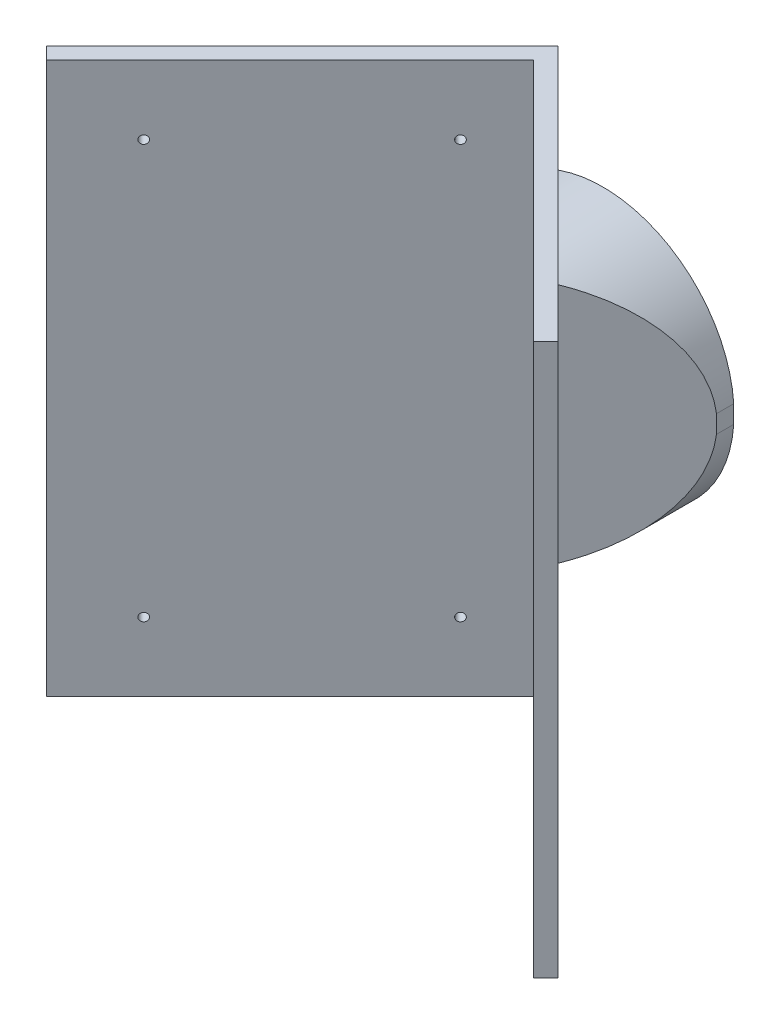
ISO-10303-21;
HEADER;
FILE_DESCRIPTION(('STEP AP214'),'2;1');
FILE_NAME('part.step','',(''),(''),'','','');
FILE_SCHEMA(('AUTOMOTIVE_DESIGN { 1 0 10303 214 1 1 1 1 }'));
ENDSEC;
DATA;
#1=APPLICATION_CONTEXT('core data for automotive mechanical design processes');
#2=APPLICATION_PROTOCOL_DEFINITION('international standard','automotive_design',2000,#1);
#3=PRODUCT_CONTEXT('',#1,'mechanical');
#4=PRODUCT('Part','Part','',(#3));
#5=PRODUCT_RELATED_PRODUCT_CATEGORY('part','',(#4));
#6=PRODUCT_DEFINITION_FORMATION('','',#4);
#7=PRODUCT_DEFINITION_CONTEXT('part definition',#1,'design');
#8=PRODUCT_DEFINITION('design','',#6,#7);
#9=PRODUCT_DEFINITION_SHAPE('','',#8);
#10=(LENGTH_UNIT() NAMED_UNIT(*) SI_UNIT(.MILLI.,.METRE.));
#11=(NAMED_UNIT(*) PLANE_ANGLE_UNIT() SI_UNIT($,.RADIAN.));
#12=(NAMED_UNIT(*) SI_UNIT($,.STERADIAN.) SOLID_ANGLE_UNIT());
#13=UNCERTAINTY_MEASURE_WITH_UNIT(LENGTH_MEASURE(1.E-05),#10,'distance_accuracy_value','');
#14=(GEOMETRIC_REPRESENTATION_CONTEXT(3) GLOBAL_UNCERTAINTY_ASSIGNED_CONTEXT((#13)) GLOBAL_UNIT_ASSIGNED_CONTEXT((#10,
#11,#12)) REPRESENTATION_CONTEXT('',''));
#15=CARTESIAN_POINT('',(0.,0.,0.));
#16=DIRECTION('',(0.,0.,1.));
#17=DIRECTION('',(1.,0.,0.));
#18=AXIS2_PLACEMENT_3D('',#15,#16,#17);
#19=CARTESIAN_POINT('',(31.5055912825671,38.101,31.5055912825675));
#20=DIRECTION('',(0.707106781186544,0.,0.707106781186551));
#21=DIRECTION('',(0.707106781186551,0.,-0.707106781186544));
#22=AXIS2_PLACEMENT_3D('',#19,#20,#21);
#23=PLANE('',#22);
#24=DIRECTION('',(0.,-1.,0.));
#25=VECTOR('',#24,1.);
#26=CARTESIAN_POINT('',(38.0111825651347,38.101,25.));
#27=LINE('',#26,#25);
#28=CARTESIAN_POINT('',(38.0111825651347,2.59999999999999,25.));
#29=VERTEX_POINT('',#28);
#30=CARTESIAN_POINT('',(38.0111825651347,-2.59999999999982,25.));
#31=VERTEX_POINT('',#30);
#32=EDGE_CURVE('E97',#29,#31,#27,.T.);
#33=ORIENTED_EDGE('',*,*,#32,.F.);
#34=CARTESIAN_POINT('',(0.,0.,63.0111825651343));
#35=DIRECTION('',(0.707106781186544,0.,0.707106781186551));
#36=DIRECTION('',(-0.707106781186551,0.,0.707106781186544));
#37=AXIS2_PLACEMENT_3D('',#34,#35,#36);
#38=ELLIPSE('',#37,53.8815367264146,38.1);
#39=CARTESIAN_POINT('',(15.,35.0229924478192,48.0111825651345));
#40=VERTEX_POINT('',#39);
#41=EDGE_CURVE('E115',#29,#40,#38,.T.);
#42=ORIENTED_EDGE('',*,*,#41,.T.);
#43=DIRECTION('',(0.,-1.,0.));
#44=VECTOR('',#43,1.);
#45=CARTESIAN_POINT('',(15.,38.101,48.0111825651345));
#46=LINE('',#45,#44);
#47=CARTESIAN_POINT('',(15.,-35.0229924478192,48.0111825651345));
#48=VERTEX_POINT('',#47);
#49=EDGE_CURVE('E114',#40,#48,#46,.T.);
#50=ORIENTED_EDGE('',*,*,#49,.T.);
#51=CARTESIAN_POINT('',(0.,0.,63.0111825651343));
#52=DIRECTION('',(-0.707106781186544,0.,-0.707106781186551));
#53=DIRECTION('',(-0.707106781186551,0.,0.707106781186544));
#54=AXIS2_PLACEMENT_3D('',#51,#52,#53);
#55=ELLIPSE('',#54,53.8815367264146,38.1);
#56=EDGE_CURVE('E258',#31,#48,#55,.T.);
#57=ORIENTED_EDGE('',*,*,#56,.F.);
#58=EDGE_LOOP('',(#33,#42,#50,#57));
#59=FACE_BOUND('',#58,.T.);
#60=ADVANCED_FACE('F41',(#59),#23,.T.);
#61=CARTESIAN_POINT('',(38.0111825651347,38.101,0.));
#62=DIRECTION('',(1.,0.,0.));
#63=DIRECTION('',(0.,0.,-1.));
#64=AXIS2_PLACEMENT_3D('',#61,#62,#63);
#65=PLANE('',#64);
#66=DIRECTION('',(0.,-1.,0.));
#67=VECTOR('',#66,1.);
#68=CARTESIAN_POINT('',(38.0111825651347,38.101,20.));
#69=LINE('',#68,#67);
#70=CARTESIAN_POINT('',(38.0111825651347,2.59999999999999,20.));
#71=VERTEX_POINT('',#70);
#72=CARTESIAN_POINT('',(38.0111825651347,-2.59999999999999,20.));
#73=VERTEX_POINT('',#72);
#74=EDGE_CURVE('E91',#71,#73,#69,.T.);
#75=ORIENTED_EDGE('',*,*,#74,.F.);
#76=DIRECTION('',(0.,0.,1.));
#77=VECTOR('',#76,1.);
#78=CARTESIAN_POINT('',(38.0111825651347,2.59999999999999,-135.700288353668));
#79=LINE('',#78,#77);
#80=EDGE_CURVE('E104',#71,#29,#79,.T.);
#81=ORIENTED_EDGE('',*,*,#80,.T.);
#82=ORIENTED_EDGE('',*,*,#32,.T.);
#83=DIRECTION('',(0.,0.,1.));
#84=VECTOR('',#83,1.);
#85=CARTESIAN_POINT('',(38.0111825651347,-2.59999999999999,-135.700288353668));
#86=LINE('',#85,#84);
#87=EDGE_CURVE('E107',#73,#31,#86,.T.);
#88=ORIENTED_EDGE('',*,*,#87,.F.);
#89=EDGE_LOOP('',(#75,#81,#82,#88));
#90=FACE_BOUND('',#89,.T.);
#91=ADVANCED_FACE('F103',(#90),#65,.T.);
#92=CARTESIAN_POINT('',(0.,38.101,20.));
#93=DIRECTION('',(0.,0.,-1.));
#94=DIRECTION('',(-1.,0.,0.));
#95=AXIS2_PLACEMENT_3D('',#92,#93,#94);
#96=PLANE('',#95);
#97=DIRECTION('',(0.,-1.,0.));
#98=VECTOR('',#97,1.);
#99=CARTESIAN_POINT('',(-38.0111825651347,38.101,20.));
#100=LINE('',#99,#98);
#101=CARTESIAN_POINT('',(-38.0111825651347,2.59999999999999,20.));
#102=VERTEX_POINT('',#101);
#103=CARTESIAN_POINT('',(-38.0111825651347,-2.59999999999999,20.));
#104=VERTEX_POINT('',#103);
#105=EDGE_CURVE('E96',#102,#104,#100,.T.);
#106=ORIENTED_EDGE('',*,*,#105,.F.);
#107=CARTESIAN_POINT('',(0.,0.,20.));
#108=DIRECTION('',(0.,0.,-1.));
#109=DIRECTION('',(-1.,0.,0.));
#110=AXIS2_PLACEMENT_3D('',#107,#108,#109);
#111=CIRCLE('',#110,38.1);
#112=EDGE_CURVE('E86',#102,#71,#111,.T.);
#113=ORIENTED_EDGE('',*,*,#112,.T.);
#114=ORIENTED_EDGE('',*,*,#74,.T.);
#115=CARTESIAN_POINT('',(0.,0.,20.));
#116=DIRECTION('',(0.,0.,1.));
#117=DIRECTION('',(1.,0.,0.));
#118=AXIS2_PLACEMENT_3D('',#115,#116,#117);
#119=CIRCLE('',#118,38.1);
#120=EDGE_CURVE('E253',#104,#73,#119,.T.);
#121=ORIENTED_EDGE('',*,*,#120,.F.);
#122=EDGE_LOOP('',(#106,#113,#114,#121));
#123=FACE_BOUND('',#122,.T.);
#124=ADVANCED_FACE('F89',(#123),#96,.T.);
#125=CARTESIAN_POINT('',(-38.0111825651347,38.101,0.));
#126=DIRECTION('',(1.,0.,0.));
#127=DIRECTION('',(0.,0.,-1.));
#128=AXIS2_PLACEMENT_3D('',#125,#126,#127);
#129=PLANE('',#128);
#130=DIRECTION('',(0.,0.,1.));
#131=VECTOR('',#130,1.);
#132=CARTESIAN_POINT('',(-38.0111825651347,2.59999999999999,-135.700288353668));
#133=LINE('',#132,#131);
#134=CARTESIAN_POINT('',(-38.0111825651347,2.59999999999998,25.));
#135=VERTEX_POINT('',#134);
#136=EDGE_CURVE('E11',#102,#135,#133,.T.);
#137=ORIENTED_EDGE('',*,*,#136,.F.);
#138=ORIENTED_EDGE('',*,*,#105,.T.);
#139=DIRECTION('',(0.,0.,1.));
#140=VECTOR('',#139,1.);
#141=CARTESIAN_POINT('',(-38.0111825651347,-2.59999999999999,-135.700288353668));
#142=LINE('',#141,#140);
#143=CARTESIAN_POINT('',(-38.0111825651347,-2.59999999999999,25.));
#144=VERTEX_POINT('',#143);
#145=EDGE_CURVE('E254',#104,#144,#142,.T.);
#146=ORIENTED_EDGE('',*,*,#145,.T.);
#147=DIRECTION('',(0.,-1.,0.));
#148=VECTOR('',#147,1.);
#149=CARTESIAN_POINT('',(-38.0111825651347,38.101,25.));
#150=LINE('',#149,#148);
#151=EDGE_CURVE('E70',#135,#144,#150,.T.);
#152=ORIENTED_EDGE('',*,*,#151,.F.);
#153=EDGE_LOOP('',(#137,#138,#146,#152));
#154=FACE_BOUND('',#153,.T.);
#155=ADVANCED_FACE('F368',(#154),#129,.F.);
#156=CARTESIAN_POINT('',(-31.5055912825671,38.101,31.5055912825675));
#157=DIRECTION('',(0.707106781186544,0.,-0.707106781186551));
#158=DIRECTION('',(-0.707106781186551,0.,-0.707106781186544));
#159=AXIS2_PLACEMENT_3D('',#156,#157,#158);
#160=PLANE('',#159);
#161=CARTESIAN_POINT('',(0.,0.,63.0111825651343));
#162=DIRECTION('',(0.707106781186544,0.,-0.707106781186551));
#163=DIRECTION('',(0.707106781186551,0.,0.707106781186544));
#164=AXIS2_PLACEMENT_3D('',#161,#162,#163);
#165=ELLIPSE('',#164,53.8815367264147,38.1);
#166=CARTESIAN_POINT('',(-15.,35.0229924478192,48.0111825651344));
#167=VERTEX_POINT('',#166);
#168=EDGE_CURVE('E124',#135,#167,#165,.T.);
#169=ORIENTED_EDGE('',*,*,#168,.F.);
#170=ORIENTED_EDGE('',*,*,#151,.T.);
#171=CARTESIAN_POINT('',(0.,0.,63.0111825651343));
#172=DIRECTION('',(-0.707106781186544,0.,0.707106781186551));
#173=DIRECTION('',(0.707106781186551,0.,0.707106781186544));
#174=AXIS2_PLACEMENT_3D('',#171,#172,#173);
#175=ELLIPSE('',#174,53.8815367264147,38.1);
#176=CARTESIAN_POINT('',(-15.,-35.0229924478192,48.0111825651344));
#177=VERTEX_POINT('',#176);
#178=EDGE_CURVE('E259',#144,#177,#175,.T.);
#179=ORIENTED_EDGE('',*,*,#178,.T.);
#180=DIRECTION('',(0.,-1.,0.));
#181=VECTOR('',#180,1.);
#182=CARTESIAN_POINT('',(-15.,38.101,48.0111825651344));
#183=LINE('',#182,#181);
#184=EDGE_CURVE('E59',#167,#177,#183,.T.);
#185=ORIENTED_EDGE('',*,*,#184,.F.);
#186=EDGE_LOOP('',(#169,#170,#179,#185));
#187=FACE_BOUND('',#186,.T.);
#188=ADVANCED_FACE('F366',(#187),#160,.F.);
#189=CARTESIAN_POINT('',(0.,0.,-135.700288353668));
#190=DIRECTION('',(0.,0.,1.));
#191=DIRECTION('',(1.,0.,0.));
#192=AXIS2_PLACEMENT_3D('',#189,#190,#191);
#193=CYLINDRICAL_SURFACE('',#192,38.1);
#194=ORIENTED_EDGE('',*,*,#168,.T.);
#195=CARTESIAN_POINT('',(0.,0.,33.0111825651343));
#196=DIRECTION('',(-0.707106781186551,0.,-0.707106781186544));
#197=DIRECTION('',(-0.707106781186544,0.,0.707106781186551));
#198=AXIS2_PLACEMENT_3D('',#195,#196,#197);
#199=ELLIPSE('',#198,53.8815367264152,38.1);
#200=CARTESIAN_POINT('',(0.,38.1,33.0111825651343));
#201=VERTEX_POINT('',#200);
#202=EDGE_CURVE('E122',#167,#201,#199,.T.);
#203=ORIENTED_EDGE('',*,*,#202,.T.);
#204=CARTESIAN_POINT('',(0.,0.,33.0111825651343));
#205=DIRECTION('',(0.707106781186551,0.,-0.707106781186544));
#206=DIRECTION('',(0.707106781186544,0.,0.707106781186551));
#207=AXIS2_PLACEMENT_3D('',#204,#205,#206);
#208=ELLIPSE('',#207,53.8815367264152,38.1);
#209=EDGE_CURVE('E49',#201,#40,#208,.T.);
#210=ORIENTED_EDGE('',*,*,#209,.T.);
#211=ORIENTED_EDGE('',*,*,#41,.F.);
#212=ORIENTED_EDGE('',*,*,#80,.F.);
#213=ORIENTED_EDGE('',*,*,#112,.F.);
#214=ORIENTED_EDGE('',*,*,#136,.T.);
#215=EDGE_LOOP('',(#194,#203,#210,#211,#212,#213,#214));
#216=FACE_BOUND('',#215,.T.);
#217=ADVANCED_FACE('F43',(#216),#193,.T.);
#218=CARTESIAN_POINT('',(0.,0.,-135.700288353668));
#219=DIRECTION('',(0.,0.,1.));
#220=DIRECTION('',(1.,0.,0.));
#221=AXIS2_PLACEMENT_3D('',#218,#219,#220);
#222=CYLINDRICAL_SURFACE('',#221,38.1);
#223=CARTESIAN_POINT('',(0.,0.,33.0111825651343));
#224=DIRECTION('',(0.707106781186551,0.,0.707106781186544));
#225=DIRECTION('',(-0.707106781186544,0.,0.707106781186551));
#226=AXIS2_PLACEMENT_3D('',#223,#224,#225);
#227=ELLIPSE('',#226,53.8815367264152,38.1);
#228=CARTESIAN_POINT('',(0.,-38.1,33.0111825651343));
#229=VERTEX_POINT('',#228);
#230=EDGE_CURVE('E126',#177,#229,#227,.T.);
#231=ORIENTED_EDGE('',*,*,#230,.F.);
#232=ORIENTED_EDGE('',*,*,#178,.F.);
#233=ORIENTED_EDGE('',*,*,#145,.F.);
#234=ORIENTED_EDGE('',*,*,#120,.T.);
#235=ORIENTED_EDGE('',*,*,#87,.T.);
#236=ORIENTED_EDGE('',*,*,#56,.T.);
#237=CARTESIAN_POINT('',(0.,0.,33.0111825651343));
#238=DIRECTION('',(-0.707106781186551,0.,0.707106781186544));
#239=DIRECTION('',(0.707106781186544,0.,0.707106781186551));
#240=AXIS2_PLACEMENT_3D('',#237,#238,#239);
#241=ELLIPSE('',#240,53.8815367264152,38.1);
#242=EDGE_CURVE('E252',#229,#48,#241,.T.);
#243=ORIENTED_EDGE('',*,*,#242,.F.);
#244=EDGE_LOOP('',(#231,#232,#233,#234,#235,#236,#243));
#245=FACE_BOUND('',#244,.T.);
#246=ADVANCED_FACE('F267',(#245),#222,.T.);
#247=CARTESIAN_POINT('',(16.5055912825671,80.,16.505591282567));
#248=DIRECTION('',(-0.707106781186551,0.,-0.707106781186544));
#249=DIRECTION('',(-0.707106781186544,0.,0.707106781186551));
#250=AXIS2_PLACEMENT_3D('',#247,#248,#249);
#251=PLANE('',#250);
#252=CARTESIAN_POINT('',(-60.1040764008562,60.,93.1152589659911));
#253=DIRECTION('',(-0.707106781186551,0.,-0.707106781186544));
#254=DIRECTION('',(-0.707106781186544,0.,0.707106781186551));
#255=AXIS2_PLACEMENT_3D('',#252,#253,#254);
#256=CIRCLE('',#255,2.2);
#257=CARTESIAN_POINT('',(-61.6597113194666,60.,94.6708938846015));
#258=VERTEX_POINT('',#257);
#259=EDGE_CURVE('E155',#258,#258,#256,.T.);
#260=ORIENTED_EDGE('',*,*,#259,.F.);
#261=EDGE_LOOP('',(#260));
#262=FACE_BOUND('',#261,.T.);
#263=CARTESIAN_POINT('',(-14.1421356237309,60.,47.1533181888653));
#264=DIRECTION('',(-0.707106781186551,0.,-0.707106781186544));
#265=DIRECTION('',(-0.707106781186544,0.,0.707106781186551));
#266=AXIS2_PLACEMENT_3D('',#263,#264,#265);
#267=CIRCLE('',#266,2.2);
#268=CARTESIAN_POINT('',(-15.6977705423413,60.,48.7089531074757));
#269=VERTEX_POINT('',#268);
#270=EDGE_CURVE('E150',#269,#269,#267,.T.);
#271=ORIENTED_EDGE('',*,*,#270,.F.);
#272=EDGE_LOOP('',(#271));
#273=FACE_BOUND('',#272,.T.);
#274=CARTESIAN_POINT('',(-14.1421356237309,-60.,47.1533181888653));
#275=DIRECTION('',(-0.707106781186551,0.,-0.707106781186544));
#276=DIRECTION('',(-0.707106781186544,0.,0.707106781186551));
#277=AXIS2_PLACEMENT_3D('',#274,#275,#276);
#278=CIRCLE('',#277,2.2);
#279=CARTESIAN_POINT('',(-15.6977705423413,-60.,48.7089531074757));
#280=VERTEX_POINT('',#279);
#281=EDGE_CURVE('E142',#280,#280,#278,.T.);
#282=ORIENTED_EDGE('',*,*,#281,.F.);
#283=EDGE_LOOP('',(#282));
#284=FACE_BOUND('',#283,.T.);
#285=CARTESIAN_POINT('',(-60.1040764008562,-60.,93.1152589659911));
#286=DIRECTION('',(-0.707106781186551,0.,-0.707106781186544));
#287=DIRECTION('',(-0.707106781186544,0.,0.707106781186551));
#288=AXIS2_PLACEMENT_3D('',#285,#286,#287);
#289=CIRCLE('',#288,2.2);
#290=CARTESIAN_POINT('',(-61.6597113194666,-60.,94.6708938846015));
#291=VERTEX_POINT('',#290);
#292=EDGE_CURVE('E140',#291,#291,#289,.T.);
#293=ORIENTED_EDGE('',*,*,#292,.F.);
#294=EDGE_LOOP('',(#293));
#295=FACE_BOUND('',#294,.T.);
#296=ORIENTED_EDGE('',*,*,#202,.F.);
#297=ORIENTED_EDGE('',*,*,#184,.T.);
#298=ORIENTED_EDGE('',*,*,#230,.T.);
#299=DIRECTION('',(0.,-1.,0.));
#300=VECTOR('',#299,1.);
#301=CARTESIAN_POINT('',(0.,80.,33.0111825651343));
#302=LINE('',#301,#300);
#303=CARTESIAN_POINT('',(0.,-80.,33.0111825651343));
#304=VERTEX_POINT('',#303);
#305=EDGE_CURVE('E250',#229,#304,#302,.T.);
#306=ORIENTED_EDGE('',*,*,#305,.T.);
#307=DIRECTION('',(0.707106781186544,0.,-0.707106781186551));
#308=VECTOR('',#307,1.);
#309=CARTESIAN_POINT('',(16.5055912825671,-80.,16.505591282567));
#310=LINE('',#309,#308);
#311=CARTESIAN_POINT('',(-74.2462120245871,-80.,107.257394589722));
#312=VERTEX_POINT('',#311);
#313=EDGE_CURVE('E218',#312,#304,#310,.T.);
#314=ORIENTED_EDGE('',*,*,#313,.F.);
#315=DIRECTION('',(0.,-1.,0.));
#316=VECTOR('',#315,1.);
#317=CARTESIAN_POINT('',(-74.2462120245871,80.,107.257394589722));
#318=LINE('',#317,#316);
#319=CARTESIAN_POINT('',(-74.2462120245871,80.,107.257394589722));
#320=VERTEX_POINT('',#319);
#321=EDGE_CURVE('E244',#320,#312,#318,.T.);
#322=ORIENTED_EDGE('',*,*,#321,.F.);
#323=DIRECTION('',(0.707106781186544,0.,-0.707106781186551));
#324=VECTOR('',#323,1.);
#325=CARTESIAN_POINT('',(16.5055912825671,80.,16.505591282567));
#326=LINE('',#325,#324);
#327=CARTESIAN_POINT('',(0.,80.,33.0111825651343));
#328=VERTEX_POINT('',#327);
#329=EDGE_CURVE('E199',#320,#328,#326,.T.);
#330=ORIENTED_EDGE('',*,*,#329,.T.);
#331=EDGE_CURVE('E249',#328,#201,#302,.T.);
#332=ORIENTED_EDGE('',*,*,#331,.T.);
#333=EDGE_LOOP('',(#296,#297,#298,#306,#314,#322,#330,#332));
#334=FACE_BOUND('',#333,.T.);
#335=ADVANCED_FACE('F290',(#262,#273,#284,#295,#334),#251,.T.);
#336=CARTESIAN_POINT('',(-16.5055912825671,80.,16.505591282567));
#337=DIRECTION('',(0.707106781186551,0.,-0.707106781186544));
#338=DIRECTION('',(-0.707106781186544,0.,-0.707106781186551));
#339=AXIS2_PLACEMENT_3D('',#336,#337,#338);
#340=PLANE('',#339);
#341=CARTESIAN_POINT('',(60.1040764008562,60.,93.1152589659911));
#342=DIRECTION('',(0.707106781186551,0.,-0.707106781186544));
#343=DIRECTION('',(-0.707106781186544,0.,-0.707106781186551));
#344=AXIS2_PLACEMENT_3D('',#341,#342,#343);
#345=CIRCLE('',#344,2.2);
#346=CARTESIAN_POINT('',(58.5484414822458,60.,91.5596240473807));
#347=VERTEX_POINT('',#346);
#348=EDGE_CURVE('E599',#347,#347,#345,.T.);
#349=ORIENTED_EDGE('',*,*,#348,.F.);
#350=EDGE_LOOP('',(#349));
#351=FACE_BOUND('',#350,.T.);
#352=CARTESIAN_POINT('',(14.1421356237309,60.,47.1533181888653));
#353=DIRECTION('',(0.707106781186551,0.,-0.707106781186544));
#354=DIRECTION('',(-0.707106781186544,0.,-0.707106781186551));
#355=AXIS2_PLACEMENT_3D('',#352,#353,#354);
#356=CIRCLE('',#355,2.2);
#357=CARTESIAN_POINT('',(12.5865007051205,60.,45.5976832702549));
#358=VERTEX_POINT('',#357);
#359=EDGE_CURVE('E170',#358,#358,#356,.T.);
#360=ORIENTED_EDGE('',*,*,#359,.F.);
#361=EDGE_LOOP('',(#360));
#362=FACE_BOUND('',#361,.T.);
#363=CARTESIAN_POINT('',(14.1421356237309,-60.,47.1533181888653));
#364=DIRECTION('',(0.707106781186551,0.,-0.707106781186544));
#365=DIRECTION('',(-0.707106781186544,0.,-0.707106781186551));
#366=AXIS2_PLACEMENT_3D('',#363,#364,#365);
#367=CIRCLE('',#366,2.2);
#368=CARTESIAN_POINT('',(12.5865007051205,-60.,45.5976832702549));
#369=VERTEX_POINT('',#368);
#370=EDGE_CURVE('E159',#369,#369,#367,.T.);
#371=ORIENTED_EDGE('',*,*,#370,.F.);
#372=EDGE_LOOP('',(#371));
#373=FACE_BOUND('',#372,.T.);
#374=CARTESIAN_POINT('',(60.1040764008562,-60.,93.1152589659911));
#375=DIRECTION('',(0.707106781186551,0.,-0.707106781186544));
#376=DIRECTION('',(-0.707106781186544,0.,-0.707106781186551));
#377=AXIS2_PLACEMENT_3D('',#374,#375,#376);
#378=CIRCLE('',#377,2.2);
#379=CARTESIAN_POINT('',(58.5484414822458,-60.,91.5596240473807));
#380=VERTEX_POINT('',#379);
#381=EDGE_CURVE('E156',#380,#380,#378,.T.);
#382=ORIENTED_EDGE('',*,*,#381,.F.);
#383=EDGE_LOOP('',(#382));
#384=FACE_BOUND('',#383,.T.);
#385=ORIENTED_EDGE('',*,*,#49,.F.);
#386=ORIENTED_EDGE('',*,*,#209,.F.);
#387=ORIENTED_EDGE('',*,*,#331,.F.);
#388=DIRECTION('',(0.707106781186544,0.,0.707106781186551));
#389=VECTOR('',#388,1.);
#390=CARTESIAN_POINT('',(-16.5055912825671,80.,16.505591282567));
#391=LINE('',#390,#389);
#392=CARTESIAN_POINT('',(74.2462120245871,80.,107.257394589722));
#393=VERTEX_POINT('',#392);
#394=EDGE_CURVE('E197',#328,#393,#391,.T.);
#395=ORIENTED_EDGE('',*,*,#394,.T.);
#396=DIRECTION('',(0.,-1.,0.));
#397=VECTOR('',#396,1.);
#398=CARTESIAN_POINT('',(74.2462120245871,80.,107.257394589722));
#399=LINE('',#398,#397);
#400=CARTESIAN_POINT('',(74.2462120245871,-80.,107.257394589722));
#401=VERTEX_POINT('',#400);
#402=EDGE_CURVE('E216',#393,#401,#399,.T.);
#403=ORIENTED_EDGE('',*,*,#402,.T.);
#404=DIRECTION('',(0.707106781186544,0.,0.707106781186551));
#405=VECTOR('',#404,1.);
#406=CARTESIAN_POINT('',(-16.5055912825671,-80.,16.505591282567));
#407=LINE('',#406,#405);
#408=EDGE_CURVE('E135',#304,#401,#407,.T.);
#409=ORIENTED_EDGE('',*,*,#408,.F.);
#410=ORIENTED_EDGE('',*,*,#305,.F.);
#411=ORIENTED_EDGE('',*,*,#242,.T.);
#412=EDGE_LOOP('',(#385,#386,#387,#395,#403,#409,#410,#411));
#413=FACE_BOUND('',#412,.T.);
#414=ADVANCED_FACE('F277',(#351,#362,#373,#384,#413),#340,.T.);
#415=CARTESIAN_POINT('',(-90.7518033071549,80.,90.7518033071542));
#416=DIRECTION('',(0.70710678118655,0.,-0.707106781186545));
#417=DIRECTION('',(-0.707106781186545,0.,-0.70710678118655));
#418=AXIS2_PLACEMENT_3D('',#415,#416,#417);
#419=PLANE('',#418);
#420=DIRECTION('',(0.707106781186545,0.,0.70710678118655));
#421=VECTOR('',#420,1.);
#422=CARTESIAN_POINT('',(-90.7518033071549,-80.,90.7518033071542));
#423=LINE('',#422,#421);
#424=CARTESIAN_POINT('',(-70.7106781186544,-80.,110.792928495655));
#425=VERTEX_POINT('',#424);
#426=EDGE_CURVE('E225',#312,#425,#423,.T.);
#427=ORIENTED_EDGE('',*,*,#426,.T.);
#428=DIRECTION('',(0.,-1.,0.));
#429=VECTOR('',#428,1.);
#430=CARTESIAN_POINT('',(-70.7106781186544,80.,110.792928495655));
#431=LINE('',#430,#429);
#432=CARTESIAN_POINT('',(-70.7106781186544,80.,110.792928495655));
#433=VERTEX_POINT('',#432);
#434=EDGE_CURVE('E243',#433,#425,#431,.T.);
#435=ORIENTED_EDGE('',*,*,#434,.F.);
#436=DIRECTION('',(0.707106781186545,0.,0.70710678118655));
#437=VECTOR('',#436,1.);
#438=CARTESIAN_POINT('',(-90.7518033071549,80.,90.7518033071542));
#439=LINE('',#438,#437);
#440=EDGE_CURVE('E204',#320,#433,#439,.T.);
#441=ORIENTED_EDGE('',*,*,#440,.F.);
#442=ORIENTED_EDGE('',*,*,#321,.T.);
#443=EDGE_LOOP('',(#427,#435,#441,#442));
#444=FACE_BOUND('',#443,.T.);
#445=ADVANCED_FACE('F336',(#444),#419,.F.);
#446=CARTESIAN_POINT('',(20.0411251884999,80.,20.0411251884997));
#447=DIRECTION('',(0.707106781186551,0.,0.707106781186544));
#448=DIRECTION('',(0.707106781186544,0.,-0.707106781186551));
#449=AXIS2_PLACEMENT_3D('',#446,#447,#448);
#450=PLANE('',#449);
#451=CARTESIAN_POINT('',(-56.5685424949235,60.,96.6507928719238));
#452=DIRECTION('',(0.707106781186551,0.,0.707106781186544));
#453=DIRECTION('',(0.707106781186544,0.,-0.707106781186551));
#454=AXIS2_PLACEMENT_3D('',#451,#452,#453);
#455=CIRCLE('',#454,1.19999999999999);
#456=CARTESIAN_POINT('',(-55.7200143574997,60.,95.8022647344999));
#457=VERTEX_POINT('',#456);
#458=EDGE_CURVE('E145',#457,#457,#455,.T.);
#459=ORIENTED_EDGE('',*,*,#458,.F.);
#460=EDGE_LOOP('',(#459));
#461=FACE_BOUND('',#460,.T.);
#462=CARTESIAN_POINT('',(-10.6066017177981,60.,50.688852094798));
#463=DIRECTION('',(0.707106781186551,0.,0.707106781186544));
#464=DIRECTION('',(0.707106781186544,0.,-0.707106781186551));
#465=AXIS2_PLACEMENT_3D('',#462,#463,#464);
#466=CIRCLE('',#465,1.19999999999999);
#467=CARTESIAN_POINT('',(-9.75807358037429,60.,49.8403239573742));
#468=VERTEX_POINT('',#467);
#469=EDGE_CURVE('E136',#468,#468,#466,.T.);
#470=ORIENTED_EDGE('',*,*,#469,.F.);
#471=EDGE_LOOP('',(#470));
#472=FACE_BOUND('',#471,.T.);
#473=CARTESIAN_POINT('',(-10.6066017177981,-60.,50.688852094798));
#474=DIRECTION('',(0.707106781186551,0.,0.707106781186544));
#475=DIRECTION('',(0.707106781186544,0.,-0.707106781186551));
#476=AXIS2_PLACEMENT_3D('',#473,#474,#475);
#477=CIRCLE('',#476,1.19999999999999);
#478=CARTESIAN_POINT('',(-9.75807358037429,-60.,49.8403239573742));
#479=VERTEX_POINT('',#478);
#480=EDGE_CURVE('E134',#479,#479,#477,.T.);
#481=ORIENTED_EDGE('',*,*,#480,.F.);
#482=EDGE_LOOP('',(#481));
#483=FACE_BOUND('',#482,.T.);
#484=CARTESIAN_POINT('',(-56.5685424949235,-60.,96.6507928719238));
#485=DIRECTION('',(0.707106781186551,0.,0.707106781186544));
#486=DIRECTION('',(0.707106781186544,0.,-0.707106781186551));
#487=AXIS2_PLACEMENT_3D('',#484,#485,#486);
#488=CIRCLE('',#487,1.19999999999999);
#489=CARTESIAN_POINT('',(-55.7200143574997,-60.,95.8022647344999));
#490=VERTEX_POINT('',#489);
#491=EDGE_CURVE('E129',#490,#490,#488,.T.);
#492=ORIENTED_EDGE('',*,*,#491,.F.);
#493=EDGE_LOOP('',(#492));
#494=FACE_BOUND('',#493,.T.);
#495=DIRECTION('',(-0.707106781186544,0.,0.707106781186551));
#496=VECTOR('',#495,1.);
#497=CARTESIAN_POINT('',(20.0411251884999,-80.,20.0411251884997));
#498=LINE('',#497,#496);
#499=CARTESIAN_POINT('',(0.,-80.,40.0822503769998));
#500=VERTEX_POINT('',#499);
#501=EDGE_CURVE('E223',#500,#425,#498,.T.);
#502=ORIENTED_EDGE('',*,*,#501,.F.);
#503=DIRECTION('',(0.,-1.,0.));
#504=VECTOR('',#503,1.);
#505=CARTESIAN_POINT('',(0.,80.,40.0822503769998));
#506=LINE('',#505,#504);
#507=CARTESIAN_POINT('',(0.,80.,40.0822503769998));
#508=VERTEX_POINT('',#507);
#509=EDGE_CURVE('E236',#508,#500,#506,.T.);
#510=ORIENTED_EDGE('',*,*,#509,.F.);
#511=DIRECTION('',(-0.707106781186544,0.,0.707106781186551));
#512=VECTOR('',#511,1.);
#513=CARTESIAN_POINT('',(20.0411251884999,80.,20.0411251884997));
#514=LINE('',#513,#512);
#515=EDGE_CURVE('E210',#508,#433,#514,.T.);
#516=ORIENTED_EDGE('',*,*,#515,.T.);
#517=ORIENTED_EDGE('',*,*,#434,.T.);
#518=EDGE_LOOP('',(#502,#510,#516,#517));
#519=FACE_BOUND('',#518,.T.);
#520=ADVANCED_FACE('F337',(#461,#472,#483,#494,#519),#450,.T.);
#521=CARTESIAN_POINT('',(-20.0411251884999,80.,20.0411251884997));
#522=DIRECTION('',(0.707106781186551,0.,-0.707106781186544));
#523=DIRECTION('',(-0.707106781186544,0.,-0.707106781186551));
#524=AXIS2_PLACEMENT_3D('',#521,#522,#523);
#525=PLANE('',#524);
#526=CARTESIAN_POINT('',(56.5685424949235,60.,96.6507928719238));
#527=DIRECTION('',(0.707106781186551,0.,-0.707106781186544));
#528=DIRECTION('',(-0.707106781186544,0.,-0.707106781186551));
#529=AXIS2_PLACEMENT_3D('',#526,#527,#528);
#530=CIRCLE('',#529,1.19999999999999);
#531=CARTESIAN_POINT('',(55.7200143574996,60.,95.8022647345));
#532=VERTEX_POINT('',#531);
#533=EDGE_CURVE('E44',#532,#532,#530,.T.);
#534=ORIENTED_EDGE('',*,*,#533,.T.);
#535=EDGE_LOOP('',(#534));
#536=FACE_BOUND('',#535,.T.);
#537=CARTESIAN_POINT('',(10.6066017177981,60.,50.688852094798));
#538=DIRECTION('',(0.707106781186551,0.,-0.707106781186544));
#539=DIRECTION('',(-0.707106781186544,0.,-0.707106781186551));
#540=AXIS2_PLACEMENT_3D('',#537,#538,#539);
#541=CIRCLE('',#540,1.19999999999999);
#542=CARTESIAN_POINT('',(9.75807358037428,60.,49.8403239573742));
#543=VERTEX_POINT('',#542);
#544=EDGE_CURVE('E158',#543,#543,#541,.T.);
#545=ORIENTED_EDGE('',*,*,#544,.T.);
#546=EDGE_LOOP('',(#545));
#547=FACE_BOUND('',#546,.T.);
#548=CARTESIAN_POINT('',(10.6066017177981,-60.,50.688852094798));
#549=DIRECTION('',(0.707106781186551,0.,-0.707106781186544));
#550=DIRECTION('',(-0.707106781186544,0.,-0.707106781186551));
#551=AXIS2_PLACEMENT_3D('',#548,#549,#550);
#552=CIRCLE('',#551,1.19999999999999);
#553=CARTESIAN_POINT('',(9.75807358037428,-60.,49.8403239573742));
#554=VERTEX_POINT('',#553);
#555=EDGE_CURVE('E152',#554,#554,#552,.T.);
#556=ORIENTED_EDGE('',*,*,#555,.T.);
#557=EDGE_LOOP('',(#556));
#558=FACE_BOUND('',#557,.T.);
#559=CARTESIAN_POINT('',(56.5685424949235,-60.,96.6507928719238));
#560=DIRECTION('',(0.707106781186551,0.,-0.707106781186544));
#561=DIRECTION('',(-0.707106781186544,0.,-0.707106781186551));
#562=AXIS2_PLACEMENT_3D('',#559,#560,#561);
#563=CIRCLE('',#562,1.19999999999999);
#564=CARTESIAN_POINT('',(55.7200143574996,-60.,95.8022647345));
#565=VERTEX_POINT('',#564);
#566=EDGE_CURVE('E149',#565,#565,#563,.T.);
#567=ORIENTED_EDGE('',*,*,#566,.T.);
#568=EDGE_LOOP('',(#567));
#569=FACE_BOUND('',#568,.T.);
#570=DIRECTION('',(0.707106781186544,0.,0.707106781186551));
#571=VECTOR('',#570,1.);
#572=CARTESIAN_POINT('',(-20.0411251884999,-80.,20.0411251884997));
#573=LINE('',#572,#571);
#574=CARTESIAN_POINT('',(70.7106781186544,-80.,110.792928495655));
#575=VERTEX_POINT('',#574);
#576=EDGE_CURVE('E226',#500,#575,#573,.T.);
#577=ORIENTED_EDGE('',*,*,#576,.T.);
#578=DIRECTION('',(0.,-1.,0.));
#579=VECTOR('',#578,1.);
#580=CARTESIAN_POINT('',(70.7106781186544,80.,110.792928495655));
#581=LINE('',#580,#579);
#582=CARTESIAN_POINT('',(70.7106781186544,80.,110.792928495655));
#583=VERTEX_POINT('',#582);
#584=EDGE_CURVE('E233',#583,#575,#581,.T.);
#585=ORIENTED_EDGE('',*,*,#584,.F.);
#586=DIRECTION('',(0.707106781186544,0.,0.707106781186551));
#587=VECTOR('',#586,1.);
#588=CARTESIAN_POINT('',(-20.0411251884999,80.,20.0411251884997));
#589=LINE('',#588,#587);
#590=EDGE_CURVE('E209',#508,#583,#589,.T.);
#591=ORIENTED_EDGE('',*,*,#590,.F.);
#592=ORIENTED_EDGE('',*,*,#509,.T.);
#593=EDGE_LOOP('',(#577,#585,#591,#592));
#594=FACE_BOUND('',#593,.T.);
#595=ADVANCED_FACE('F345',(#536,#547,#558,#569,#594),#525,.F.);
#596=CARTESIAN_POINT('',(90.7518033071549,80.,90.7518033071542));
#597=DIRECTION('',(0.70710678118655,0.,0.707106781186545));
#598=DIRECTION('',(0.707106781186545,0.,-0.70710678118655));
#599=AXIS2_PLACEMENT_3D('',#596,#597,#598);
#600=PLANE('',#599);
#601=DIRECTION('',(-0.707106781186545,0.,0.70710678118655));
#602=VECTOR('',#601,1.);
#603=CARTESIAN_POINT('',(90.7518033071549,-80.,90.7518033071542));
#604=LINE('',#603,#602);
#605=EDGE_CURVE('E203',#401,#575,#604,.T.);
#606=ORIENTED_EDGE('',*,*,#605,.F.);
#607=ORIENTED_EDGE('',*,*,#402,.F.);
#608=DIRECTION('',(-0.707106781186545,0.,0.70710678118655));
#609=VECTOR('',#608,1.);
#610=CARTESIAN_POINT('',(90.7518033071549,80.,90.7518033071542));
#611=LINE('',#610,#609);
#612=EDGE_CURVE('E213',#393,#583,#611,.T.);
#613=ORIENTED_EDGE('',*,*,#612,.T.);
#614=ORIENTED_EDGE('',*,*,#584,.T.);
#615=EDGE_LOOP('',(#606,#607,#613,#614));
#616=FACE_BOUND('',#615,.T.);
#617=ADVANCED_FACE('F332',(#616),#600,.T.);
#618=CARTESIAN_POINT('',(0.,80.,0.));
#619=DIRECTION('',(0.,1.,0.));
#620=DIRECTION('',(0.,0.,1.));
#621=AXIS2_PLACEMENT_3D('',#618,#619,#620);
#622=PLANE('',#621);
#623=ORIENTED_EDGE('',*,*,#394,.F.);
#624=ORIENTED_EDGE('',*,*,#329,.F.);
#625=ORIENTED_EDGE('',*,*,#440,.T.);
#626=ORIENTED_EDGE('',*,*,#515,.F.);
#627=ORIENTED_EDGE('',*,*,#590,.T.);
#628=ORIENTED_EDGE('',*,*,#612,.F.);
#629=EDGE_LOOP('',(#623,#624,#625,#626,#627,#628));
#630=FACE_BOUND('',#629,.T.);
#631=ADVANCED_FACE('F312',(#630),#622,.T.);
#632=CARTESIAN_POINT('',(0.,-80.,0.));
#633=DIRECTION('',(0.,1.,0.));
#634=DIRECTION('',(0.,0.,1.));
#635=AXIS2_PLACEMENT_3D('',#632,#633,#634);
#636=PLANE('',#635);
#637=ORIENTED_EDGE('',*,*,#408,.T.);
#638=ORIENTED_EDGE('',*,*,#605,.T.);
#639=ORIENTED_EDGE('',*,*,#576,.F.);
#640=ORIENTED_EDGE('',*,*,#501,.T.);
#641=ORIENTED_EDGE('',*,*,#426,.F.);
#642=ORIENTED_EDGE('',*,*,#313,.T.);
#643=EDGE_LOOP('',(#637,#638,#639,#640,#641,#642));
#644=FACE_BOUND('',#643,.T.);
#645=ADVANCED_FACE('F334',(#644),#636,.F.);
#646=CARTESIAN_POINT('',(-60.1040764008562,-60.,93.1152589659911));
#647=DIRECTION('',(-0.707106781186551,0.,-0.707106781186544));
#648=DIRECTION('',(-0.707106781186544,0.,0.707106781186551));
#649=AXIS2_PLACEMENT_3D('',#646,#647,#648);
#650=CYLINDRICAL_SURFACE('',#649,1.19999999999999);
#651=ORIENTED_EDGE('',*,*,#491,.T.);
#652=EDGE_LOOP('',(#651));
#653=FACE_BOUND('',#652,.T.);
#654=CARTESIAN_POINT('',(-59.3969696196697,-60.,93.8223657471776));
#655=DIRECTION('',(-0.707106781186551,0.,-0.707106781186544));
#656=DIRECTION('',(-0.707106781186544,0.,0.707106781186551));
#657=AXIS2_PLACEMENT_3D('',#654,#655,#656);
#658=CIRCLE('',#657,1.19999999999999);
#659=CARTESIAN_POINT('',(-60.2454977570935,-60.,94.6708938846015));
#660=VERTEX_POINT('',#659);
#661=EDGE_CURVE('E131',#660,#660,#658,.T.);
#662=ORIENTED_EDGE('',*,*,#661,.T.);
#663=EDGE_LOOP('',(#662));
#664=FACE_BOUND('',#663,.T.);
#665=ADVANCED_FACE('F401',(#653,#664),#650,.F.);
#666=CARTESIAN_POINT('',(-60.1040764008562,-60.,93.1152589659911));
#667=DIRECTION('',(-0.707106781186551,0.,-0.707106781186544));
#668=DIRECTION('',(-0.707106781186544,0.,0.707106781186551));
#669=AXIS2_PLACEMENT_3D('',#666,#667,#668);
#670=CONICAL_SURFACE('',#669,2.2,0.785398163397452);
#671=ORIENTED_EDGE('',*,*,#661,.F.);
#672=EDGE_LOOP('',(#671));
#673=FACE_BOUND('',#672,.T.);
#674=ORIENTED_EDGE('',*,*,#292,.T.);
#675=EDGE_LOOP('',(#674));
#676=FACE_BOUND('',#675,.T.);
#677=ADVANCED_FACE('F425',(#673,#676),#670,.F.);
#678=CARTESIAN_POINT('',(-14.1421356237309,-60.,47.1533181888653));
#679=DIRECTION('',(-0.707106781186551,0.,-0.707106781186544));
#680=DIRECTION('',(-0.707106781186544,0.,0.707106781186551));
#681=AXIS2_PLACEMENT_3D('',#678,#679,#680);
#682=CYLINDRICAL_SURFACE('',#681,1.19999999999999);
#683=ORIENTED_EDGE('',*,*,#480,.T.);
#684=EDGE_LOOP('',(#683));
#685=FACE_BOUND('',#684,.T.);
#686=CARTESIAN_POINT('',(-13.4350288425443,-60.,47.8604249700519));
#687=DIRECTION('',(-0.707106781186551,0.,-0.707106781186544));
#688=DIRECTION('',(-0.707106781186544,0.,0.707106781186551));
#689=AXIS2_PLACEMENT_3D('',#686,#687,#688);
#690=CIRCLE('',#689,1.19999999999999);
#691=CARTESIAN_POINT('',(-14.2835569799682,-60.,48.7089531074757));
#692=VERTEX_POINT('',#691);
#693=EDGE_CURVE('E139',#692,#692,#690,.T.);
#694=ORIENTED_EDGE('',*,*,#693,.T.);
#695=EDGE_LOOP('',(#694));
#696=FACE_BOUND('',#695,.T.);
#697=ADVANCED_FACE('F431',(#685,#696),#682,.F.);
#698=CARTESIAN_POINT('',(-14.1421356237309,-60.,47.1533181888653));
#699=DIRECTION('',(-0.707106781186551,0.,-0.707106781186544));
#700=DIRECTION('',(-0.707106781186544,0.,0.707106781186551));
#701=AXIS2_PLACEMENT_3D('',#698,#699,#700);
#702=CONICAL_SURFACE('',#701,2.2,0.785398163397451);
#703=ORIENTED_EDGE('',*,*,#693,.F.);
#704=EDGE_LOOP('',(#703));
#705=FACE_BOUND('',#704,.T.);
#706=ORIENTED_EDGE('',*,*,#281,.T.);
#707=EDGE_LOOP('',(#706));
#708=FACE_BOUND('',#707,.T.);
#709=ADVANCED_FACE('F439',(#705,#708),#702,.F.);
#710=CARTESIAN_POINT('',(-14.1421356237309,60.,47.1533181888653));
#711=DIRECTION('',(-0.707106781186551,0.,-0.707106781186544));
#712=DIRECTION('',(-0.707106781186544,0.,0.707106781186551));
#713=AXIS2_PLACEMENT_3D('',#710,#711,#712);
#714=CYLINDRICAL_SURFACE('',#713,1.19999999999999);
#715=ORIENTED_EDGE('',*,*,#469,.T.);
#716=EDGE_LOOP('',(#715));
#717=FACE_BOUND('',#716,.T.);
#718=CARTESIAN_POINT('',(-13.4350288425443,60.,47.8604249700519));
#719=DIRECTION('',(-0.707106781186551,0.,-0.707106781186544));
#720=DIRECTION('',(-0.707106781186544,0.,0.707106781186551));
#721=AXIS2_PLACEMENT_3D('',#718,#719,#720);
#722=CIRCLE('',#721,1.19999999999999);
#723=CARTESIAN_POINT('',(-14.2835569799682,60.,48.7089531074757));
#724=VERTEX_POINT('',#723);
#725=EDGE_CURVE('E141',#724,#724,#722,.T.);
#726=ORIENTED_EDGE('',*,*,#725,.T.);
#727=EDGE_LOOP('',(#726));
#728=FACE_BOUND('',#727,.T.);
#729=ADVANCED_FACE('F449',(#717,#728),#714,.F.);
#730=CARTESIAN_POINT('',(-14.1421356237309,60.,47.1533181888653));
#731=DIRECTION('',(-0.707106781186551,0.,-0.707106781186544));
#732=DIRECTION('',(-0.707106781186544,0.,0.707106781186551));
#733=AXIS2_PLACEMENT_3D('',#730,#731,#732);
#734=CONICAL_SURFACE('',#733,2.2,0.785398163397451);
#735=ORIENTED_EDGE('',*,*,#725,.F.);
#736=EDGE_LOOP('',(#735));
#737=FACE_BOUND('',#736,.T.);
#738=ORIENTED_EDGE('',*,*,#270,.T.);
#739=EDGE_LOOP('',(#738));
#740=FACE_BOUND('',#739,.T.);
#741=ADVANCED_FACE('F456',(#737,#740),#734,.F.);
#742=CARTESIAN_POINT('',(-60.1040764008562,60.,93.1152589659911));
#743=DIRECTION('',(-0.707106781186551,0.,-0.707106781186544));
#744=DIRECTION('',(-0.707106781186544,0.,0.707106781186551));
#745=AXIS2_PLACEMENT_3D('',#742,#743,#744);
#746=CYLINDRICAL_SURFACE('',#745,1.19999999999999);
#747=ORIENTED_EDGE('',*,*,#458,.T.);
#748=EDGE_LOOP('',(#747));
#749=FACE_BOUND('',#748,.T.);
#750=CARTESIAN_POINT('',(-59.3969696196697,60.,93.8223657471776));
#751=DIRECTION('',(-0.707106781186551,0.,-0.707106781186544));
#752=DIRECTION('',(-0.707106781186544,0.,0.707106781186551));
#753=AXIS2_PLACEMENT_3D('',#750,#751,#752);
#754=CIRCLE('',#753,1.19999999999999);
#755=CARTESIAN_POINT('',(-60.2454977570935,60.,94.6708938846015));
#756=VERTEX_POINT('',#755);
#757=EDGE_CURVE('E146',#756,#756,#754,.T.);
#758=ORIENTED_EDGE('',*,*,#757,.T.);
#759=EDGE_LOOP('',(#758));
#760=FACE_BOUND('',#759,.T.);
#761=ADVANCED_FACE('F470',(#749,#760),#746,.F.);
#762=CARTESIAN_POINT('',(-60.1040764008562,60.,93.1152589659911));
#763=DIRECTION('',(-0.707106781186551,0.,-0.707106781186544));
#764=DIRECTION('',(-0.707106781186544,0.,0.707106781186551));
#765=AXIS2_PLACEMENT_3D('',#762,#763,#764);
#766=CONICAL_SURFACE('',#765,2.2,0.785398163397452);
#767=ORIENTED_EDGE('',*,*,#757,.F.);
#768=EDGE_LOOP('',(#767));
#769=FACE_BOUND('',#768,.T.);
#770=ORIENTED_EDGE('',*,*,#259,.T.);
#771=EDGE_LOOP('',(#770));
#772=FACE_BOUND('',#771,.T.);
#773=ADVANCED_FACE('F478',(#769,#772),#766,.F.);
#774=CARTESIAN_POINT('',(60.1040764008562,-60.,93.1152589659911));
#775=DIRECTION('',(0.707106781186551,0.,-0.707106781186544));
#776=DIRECTION('',(-0.707106781186544,0.,-0.707106781186551));
#777=AXIS2_PLACEMENT_3D('',#774,#775,#776);
#778=CYLINDRICAL_SURFACE('',#777,1.19999999999999);
#779=CARTESIAN_POINT('',(59.3969696196697,-60.,93.8223657471776));
#780=DIRECTION('',(0.707106781186551,0.,-0.707106781186544));
#781=DIRECTION('',(-0.707106781186544,0.,-0.707106781186551));
#782=AXIS2_PLACEMENT_3D('',#779,#780,#781);
#783=CIRCLE('',#782,1.19999999999999);
#784=CARTESIAN_POINT('',(58.5484414822458,-60.,92.9738376097538));
#785=VERTEX_POINT('',#784);
#786=EDGE_CURVE('E153',#785,#785,#783,.T.);
#787=ORIENTED_EDGE('',*,*,#786,.T.);
#788=EDGE_LOOP('',(#787));
#789=FACE_BOUND('',#788,.T.);
#790=ORIENTED_EDGE('',*,*,#566,.F.);
#791=EDGE_LOOP('',(#790));
#792=FACE_BOUND('',#791,.T.);
#793=ADVANCED_FACE('F482',(#789,#792),#778,.F.);
#794=CARTESIAN_POINT('',(60.1040764008562,-60.,93.1152589659911));
#795=DIRECTION('',(0.707106781186551,0.,-0.707106781186544));
#796=DIRECTION('',(-0.707106781186544,0.,-0.707106781186551));
#797=AXIS2_PLACEMENT_3D('',#794,#795,#796);
#798=CONICAL_SURFACE('',#797,2.2,0.785398163397452);
#799=ORIENTED_EDGE('',*,*,#786,.F.);
#800=EDGE_LOOP('',(#799));
#801=FACE_BOUND('',#800,.T.);
#802=ORIENTED_EDGE('',*,*,#381,.T.);
#803=EDGE_LOOP('',(#802));
#804=FACE_BOUND('',#803,.T.);
#805=ADVANCED_FACE('F522',(#801,#804),#798,.F.);
#806=CARTESIAN_POINT('',(14.1421356237309,-60.,47.1533181888653));
#807=DIRECTION('',(0.707106781186551,0.,-0.707106781186544));
#808=DIRECTION('',(-0.707106781186544,0.,-0.707106781186551));
#809=AXIS2_PLACEMENT_3D('',#806,#807,#808);
#810=CYLINDRICAL_SURFACE('',#809,1.19999999999999);
#811=CARTESIAN_POINT('',(13.4350288425443,-60.,47.8604249700519));
#812=DIRECTION('',(0.707106781186551,0.,-0.707106781186544));
#813=DIRECTION('',(-0.707106781186544,0.,-0.707106781186551));
#814=AXIS2_PLACEMENT_3D('',#811,#812,#813);
#815=CIRCLE('',#814,1.19999999999999);
#816=CARTESIAN_POINT('',(12.5865007051205,-60.,47.011896832628));
#817=VERTEX_POINT('',#816);
#818=EDGE_CURVE('E160',#817,#817,#815,.T.);
#819=ORIENTED_EDGE('',*,*,#818,.T.);
#820=EDGE_LOOP('',(#819));
#821=FACE_BOUND('',#820,.T.);
#822=ORIENTED_EDGE('',*,*,#555,.F.);
#823=EDGE_LOOP('',(#822));
#824=FACE_BOUND('',#823,.T.);
#825=ADVANCED_FACE('F529',(#821,#824),#810,.F.);
#826=CARTESIAN_POINT('',(14.1421356237309,-60.,47.1533181888653));
#827=DIRECTION('',(0.707106781186551,0.,-0.707106781186544));
#828=DIRECTION('',(-0.707106781186544,0.,-0.707106781186551));
#829=AXIS2_PLACEMENT_3D('',#826,#827,#828);
#830=CONICAL_SURFACE('',#829,2.2,0.785398163397451);
#831=ORIENTED_EDGE('',*,*,#818,.F.);
#832=EDGE_LOOP('',(#831));
#833=FACE_BOUND('',#832,.T.);
#834=ORIENTED_EDGE('',*,*,#370,.T.);
#835=EDGE_LOOP('',(#834));
#836=FACE_BOUND('',#835,.T.);
#837=ADVANCED_FACE('F537',(#833,#836),#830,.F.);
#838=CARTESIAN_POINT('',(14.1421356237309,60.,47.1533181888653));
#839=DIRECTION('',(0.707106781186551,0.,-0.707106781186544));
#840=DIRECTION('',(-0.707106781186544,0.,-0.707106781186551));
#841=AXIS2_PLACEMENT_3D('',#838,#839,#840);
#842=CYLINDRICAL_SURFACE('',#841,1.19999999999999);
#843=CARTESIAN_POINT('',(13.4350288425443,60.,47.8604249700519));
#844=DIRECTION('',(0.707106781186551,0.,-0.707106781186544));
#845=DIRECTION('',(-0.707106781186544,0.,-0.707106781186551));
#846=AXIS2_PLACEMENT_3D('',#843,#844,#845);
#847=CIRCLE('',#846,1.19999999999999);
#848=CARTESIAN_POINT('',(12.5865007051205,60.,47.011896832628));
#849=VERTEX_POINT('',#848);
#850=EDGE_CURVE('E161',#849,#849,#847,.T.);
#851=ORIENTED_EDGE('',*,*,#850,.T.);
#852=EDGE_LOOP('',(#851));
#853=FACE_BOUND('',#852,.T.);
#854=ORIENTED_EDGE('',*,*,#544,.F.);
#855=EDGE_LOOP('',(#854));
#856=FACE_BOUND('',#855,.T.);
#857=ADVANCED_FACE('F547',(#853,#856),#842,.F.);
#858=CARTESIAN_POINT('',(14.1421356237309,60.,47.1533181888653));
#859=DIRECTION('',(0.707106781186551,0.,-0.707106781186544));
#860=DIRECTION('',(-0.707106781186544,0.,-0.707106781186551));
#861=AXIS2_PLACEMENT_3D('',#858,#859,#860);
#862=CONICAL_SURFACE('',#861,2.2,0.785398163397451);
#863=ORIENTED_EDGE('',*,*,#850,.F.);
#864=EDGE_LOOP('',(#863));
#865=FACE_BOUND('',#864,.T.);
#866=ORIENTED_EDGE('',*,*,#359,.T.);
#867=EDGE_LOOP('',(#866));
#868=FACE_BOUND('',#867,.T.);
#869=ADVANCED_FACE('F560',(#865,#868),#862,.F.);
#870=CARTESIAN_POINT('',(60.1040764008562,60.,93.1152589659911));
#871=DIRECTION('',(0.707106781186551,0.,-0.707106781186544));
#872=DIRECTION('',(-0.707106781186544,0.,-0.707106781186551));
#873=AXIS2_PLACEMENT_3D('',#870,#871,#872);
#874=CYLINDRICAL_SURFACE('',#873,1.19999999999999);
#875=CARTESIAN_POINT('',(59.3969696196697,60.,93.8223657471776));
#876=DIRECTION('',(0.707106781186551,0.,-0.707106781186544));
#877=DIRECTION('',(-0.707106781186544,0.,-0.707106781186551));
#878=AXIS2_PLACEMENT_3D('',#875,#876,#877);
#879=CIRCLE('',#878,1.19999999999999);
#880=CARTESIAN_POINT('',(58.5484414822458,60.,92.9738376097538));
#881=VERTEX_POINT('',#880);
#882=EDGE_CURVE('E600',#881,#881,#879,.T.);
#883=ORIENTED_EDGE('',*,*,#882,.T.);
#884=EDGE_LOOP('',(#883));
#885=FACE_BOUND('',#884,.T.);
#886=ORIENTED_EDGE('',*,*,#533,.F.);
#887=EDGE_LOOP('',(#886));
#888=FACE_BOUND('',#887,.T.);
#889=ADVANCED_FACE('F563',(#885,#888),#874,.F.);
#890=CARTESIAN_POINT('',(60.1040764008562,60.,93.1152589659911));
#891=DIRECTION('',(0.707106781186551,0.,-0.707106781186544));
#892=DIRECTION('',(-0.707106781186544,0.,-0.707106781186551));
#893=AXIS2_PLACEMENT_3D('',#890,#891,#892);
#894=CONICAL_SURFACE('',#893,2.2,0.785398163397452);
#895=ORIENTED_EDGE('',*,*,#882,.F.);
#896=EDGE_LOOP('',(#895));
#897=FACE_BOUND('',#896,.T.);
#898=ORIENTED_EDGE('',*,*,#348,.T.);
#899=EDGE_LOOP('',(#898));
#900=FACE_BOUND('',#899,.T.);
#901=ADVANCED_FACE('F574',(#897,#900),#894,.F.);
#902=CLOSED_SHELL('',(#60,#91,#124,#155,#188,#217,#246,#335,#414,#445,#520,#595,#617,#631,#645,
#665,#677,#697,#709,#729,#741,#761,#773,#793,#805,#825,#837,#857,#869,#889,#901));
#903=MANIFOLD_SOLID_BREP('B2',#902);
#904=ADVANCED_BREP_SHAPE_REPRESENTATION('',(#18,#903),#14);
#905=SHAPE_DEFINITION_REPRESENTATION(#9,#904);
ENDSEC;
END-ISO-10303-21;
